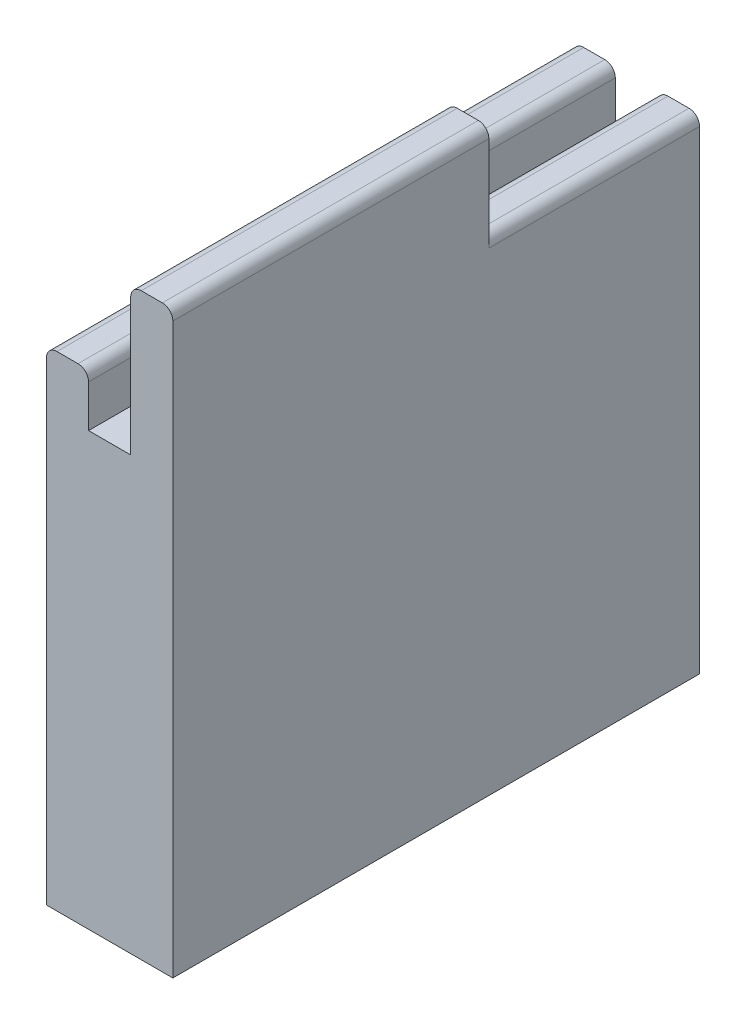
ISO-10303-21;
HEADER;
FILE_DESCRIPTION(('STEP AP214'),'2;1');
FILE_NAME('part.step','',(''),(''),'','','');
FILE_SCHEMA(('AUTOMOTIVE_DESIGN { 1 0 10303 214 1 1 1 1 }'));
ENDSEC;
DATA;
#1=APPLICATION_CONTEXT('core data for automotive mechanical design processes');
#2=APPLICATION_PROTOCOL_DEFINITION('international standard','automotive_design',2000,#1);
#3=PRODUCT_CONTEXT('',#1,'mechanical');
#4=PRODUCT('Part','Part','',(#3));
#5=PRODUCT_RELATED_PRODUCT_CATEGORY('part','',(#4));
#6=PRODUCT_DEFINITION_FORMATION('','',#4);
#7=PRODUCT_DEFINITION_CONTEXT('part definition',#1,'design');
#8=PRODUCT_DEFINITION('design','',#6,#7);
#9=PRODUCT_DEFINITION_SHAPE('','',#8);
#10=(LENGTH_UNIT() NAMED_UNIT(*) SI_UNIT(.MILLI.,.METRE.));
#11=(NAMED_UNIT(*) PLANE_ANGLE_UNIT() SI_UNIT($,.RADIAN.));
#12=(NAMED_UNIT(*) SI_UNIT($,.STERADIAN.) SOLID_ANGLE_UNIT());
#13=UNCERTAINTY_MEASURE_WITH_UNIT(LENGTH_MEASURE(1.E-05),#10,'distance_accuracy_value','');
#14=(GEOMETRIC_REPRESENTATION_CONTEXT(3) GLOBAL_UNCERTAINTY_ASSIGNED_CONTEXT((#13)) GLOBAL_UNIT_ASSIGNED_CONTEXT((#10,
#11,#12)) REPRESENTATION_CONTEXT('',''));
#15=CARTESIAN_POINT('',(0.,0.,0.));
#16=DIRECTION('',(0.,0.,1.));
#17=DIRECTION('',(1.,0.,0.));
#18=AXIS2_PLACEMENT_3D('',#15,#16,#17);
#19=CARTESIAN_POINT('',(-4.12068965517242,-20.5,25.));
#20=DIRECTION('',(1.,0.,0.));
#21=DIRECTION('',(0.,0.,-1.));
#22=AXIS2_PLACEMENT_3D('',#19,#20,#21);
#23=PLANE('',#22);
#24=DIRECTION('',(0.,-1.,0.));
#25=VECTOR('',#24,1.);
#26=CARTESIAN_POINT('',(-4.12068965517242,-20.5,25.));
#27=LINE('',#26,#25);
#28=CARTESIAN_POINT('',(-4.12068965517242,2.,25.));
#29=VERTEX_POINT('',#28);
#30=CARTESIAN_POINT('',(-4.12068965517242,-20.5,25.));
#31=VERTEX_POINT('',#30);
#32=EDGE_CURVE('E264',#29,#31,#27,.T.);
#33=ORIENTED_EDGE('',*,*,#32,.F.);
#34=DIRECTION('',(0.,0.,-1.));
#35=VECTOR('',#34,1.);
#36=CARTESIAN_POINT('',(-4.12068965517242,2.,25.));
#37=LINE('',#36,#35);
#38=CARTESIAN_POINT('',(-4.12068965517242,2.,0.));
#39=VERTEX_POINT('',#38);
#40=EDGE_CURVE('E189',#29,#39,#37,.T.);
#41=ORIENTED_EDGE('',*,*,#40,.T.);
#42=DIRECTION('',(0.,-1.,0.));
#43=VECTOR('',#42,1.);
#44=CARTESIAN_POINT('',(-4.12068965517242,-20.5,0.));
#45=LINE('',#44,#43);
#46=CARTESIAN_POINT('',(-4.12068965517242,-20.5,0.));
#47=VERTEX_POINT('',#46);
#48=EDGE_CURVE('E171',#39,#47,#45,.T.);
#49=ORIENTED_EDGE('',*,*,#48,.T.);
#50=DIRECTION('',(0.,0.,-1.));
#51=VECTOR('',#50,1.);
#52=CARTESIAN_POINT('',(-4.12068965517242,-20.5,25.));
#53=LINE('',#52,#51);
#54=EDGE_CURVE('E270',#31,#47,#53,.T.);
#55=ORIENTED_EDGE('',*,*,#54,.F.);
#56=EDGE_LOOP('',(#33,#41,#49,#55));
#57=FACE_BOUND('',#56,.T.);
#58=ADVANCED_FACE('F39',(#57),#23,.F.);
#59=CARTESIAN_POINT('',(1.87931034482758,-20.5,25.));
#60=DIRECTION('',(0.,1.,0.));
#61=DIRECTION('',(0.,0.,1.));
#62=AXIS2_PLACEMENT_3D('',#59,#60,#61);
#63=PLANE('',#62);
#64=DIRECTION('',(1.,0.,0.));
#65=VECTOR('',#64,1.);
#66=CARTESIAN_POINT('',(1.87931034482758,-20.5,0.));
#67=LINE('',#66,#65);
#68=CARTESIAN_POINT('',(1.87931034482758,-20.5,0.));
#69=VERTEX_POINT('',#68);
#70=EDGE_CURVE('E248',#47,#69,#67,.T.);
#71=ORIENTED_EDGE('',*,*,#70,.T.);
#72=DIRECTION('',(0.,0.,-1.));
#73=VECTOR('',#72,1.);
#74=CARTESIAN_POINT('',(1.87931034482758,-20.5,25.));
#75=LINE('',#74,#73);
#76=CARTESIAN_POINT('',(1.87931034482758,-20.5,25.));
#77=VERTEX_POINT('',#76);
#78=EDGE_CURVE('E268',#77,#69,#75,.T.);
#79=ORIENTED_EDGE('',*,*,#78,.F.);
#80=DIRECTION('',(1.,0.,0.));
#81=VECTOR('',#80,1.);
#82=CARTESIAN_POINT('',(1.87931034482758,-20.5,25.));
#83=LINE('',#82,#81);
#84=EDGE_CURVE('E237',#31,#77,#83,.T.);
#85=ORIENTED_EDGE('',*,*,#84,.F.);
#86=ORIENTED_EDGE('',*,*,#54,.T.);
#87=EDGE_LOOP('',(#71,#79,#85,#86));
#88=FACE_BOUND('',#87,.T.);
#89=ADVANCED_FACE('F308',(#88),#63,.F.);
#90=CARTESIAN_POINT('',(1.87931034482758,2.5,25.));
#91=DIRECTION('',(-1.,0.,0.));
#92=DIRECTION('',(0.,-1.,0.));
#93=AXIS2_PLACEMENT_3D('',#90,#91,#92);
#94=PLANE('',#93);
#95=DIRECTION('',(0.,1.,0.));
#96=VECTOR('',#95,1.);
#97=CARTESIAN_POINT('',(1.87931034482758,2.,10.));
#98=LINE('',#97,#96);
#99=CARTESIAN_POINT('',(1.87931034482758,2.,10.));
#100=VERTEX_POINT('',#99);
#101=CARTESIAN_POINT('',(1.87931034482758,6.5,10.));
#102=VERTEX_POINT('',#101);
#103=EDGE_CURVE('E152',#100,#102,#98,.T.);
#104=ORIENTED_EDGE('',*,*,#103,.T.);
#105=DIRECTION('',(0.,0.,1.));
#106=VECTOR('',#105,1.);
#107=CARTESIAN_POINT('',(1.87931034482758,6.5,25.));
#108=LINE('',#107,#106);
#109=CARTESIAN_POINT('',(1.87931034482758,6.5,25.));
#110=VERTEX_POINT('',#109);
#111=EDGE_CURVE('E204',#102,#110,#108,.T.);
#112=ORIENTED_EDGE('',*,*,#111,.T.);
#113=DIRECTION('',(0.,1.,0.));
#114=VECTOR('',#113,1.);
#115=CARTESIAN_POINT('',(1.87931034482758,2.5,25.));
#116=LINE('',#115,#114);
#117=EDGE_CURVE('E233',#77,#110,#116,.T.);
#118=ORIENTED_EDGE('',*,*,#117,.F.);
#119=ORIENTED_EDGE('',*,*,#78,.T.);
#120=DIRECTION('',(0.,1.,0.));
#121=VECTOR('',#120,1.);
#122=CARTESIAN_POINT('',(1.87931034482758,2.5,0.));
#123=LINE('',#122,#121);
#124=CARTESIAN_POINT('',(1.87931034482758,2.,0.));
#125=VERTEX_POINT('',#124);
#126=EDGE_CURVE('E178',#69,#125,#123,.T.);
#127=ORIENTED_EDGE('',*,*,#126,.T.);
#128=DIRECTION('',(0.,0.,-1.));
#129=VECTOR('',#128,1.);
#130=CARTESIAN_POINT('',(1.87931034482758,2.,25.));
#131=LINE('',#130,#129);
#132=EDGE_CURVE('E169',#125,#100,#131,.F.);
#133=ORIENTED_EDGE('',*,*,#132,.T.);
#134=EDGE_LOOP('',(#104,#112,#118,#119,#127,#133));
#135=FACE_BOUND('',#134,.T.);
#136=ADVANCED_FACE('F175',(#135),#94,.F.);
#137=CARTESIAN_POINT('',(-0.120689655172419,2.5,25.));
#138=DIRECTION('',(0.,-1.,0.));
#139=DIRECTION('',(0.,0.,-1.));
#140=AXIS2_PLACEMENT_3D('',#137,#138,#139);
#141=PLANE('',#140);
#142=DIRECTION('',(0.,0.,-1.));
#143=VECTOR('',#142,1.);
#144=CARTESIAN_POINT('',(0.379310344827581,2.5,25.));
#145=LINE('',#144,#143);
#146=CARTESIAN_POINT('',(0.379310344827581,2.5,0.));
#147=VERTEX_POINT('',#146);
#148=CARTESIAN_POINT('',(0.379310344827581,2.5,10.));
#149=VERTEX_POINT('',#148);
#150=EDGE_CURVE('E273',#147,#149,#145,.F.);
#151=ORIENTED_EDGE('',*,*,#150,.T.);
#152=DIRECTION('',(1.,0.,0.));
#153=VECTOR('',#152,1.);
#154=CARTESIAN_POINT('',(-0.120689655172419,2.5,10.));
#155=LINE('',#154,#153);
#156=CARTESIAN_POINT('',(1.37931034482758,2.5,10.));
#157=VERTEX_POINT('',#156);
#158=EDGE_CURVE('E172',#149,#157,#155,.T.);
#159=ORIENTED_EDGE('',*,*,#158,.T.);
#160=DIRECTION('',(0.,0.,-1.));
#161=VECTOR('',#160,1.);
#162=CARTESIAN_POINT('',(1.37931034482758,2.5,25.));
#163=LINE('',#162,#161);
#164=CARTESIAN_POINT('',(1.37931034482758,2.5,0.));
#165=VERTEX_POINT('',#164);
#166=EDGE_CURVE('E170',#157,#165,#163,.T.);
#167=ORIENTED_EDGE('',*,*,#166,.T.);
#168=DIRECTION('',(-1.,0.,0.));
#169=VECTOR('',#168,1.);
#170=CARTESIAN_POINT('',(-0.120689655172419,2.5,0.));
#171=LINE('',#170,#169);
#172=EDGE_CURVE('E251',#165,#147,#171,.T.);
#173=ORIENTED_EDGE('',*,*,#172,.T.);
#174=EDGE_LOOP('',(#151,#159,#167,#173));
#175=FACE_BOUND('',#174,.T.);
#176=ADVANCED_FACE('F313',(#175),#141,.F.);
#177=CARTESIAN_POINT('',(-0.120689655172419,0.,25.));
#178=DIRECTION('',(1.,0.,0.));
#179=DIRECTION('',(0.,0.,-1.));
#180=AXIS2_PLACEMENT_3D('',#177,#178,#179);
#181=PLANE('',#180);
#182=DIRECTION('',(0.,-1.,0.));
#183=VECTOR('',#182,1.);
#184=CARTESIAN_POINT('',(-0.120689655172419,0.,25.));
#185=LINE('',#184,#183);
#186=CARTESIAN_POINT('',(-0.120689655172419,6.5,25.));
#187=VERTEX_POINT('',#186);
#188=CARTESIAN_POINT('',(-0.120689655172419,0.,25.));
#189=VERTEX_POINT('',#188);
#190=EDGE_CURVE('E226',#187,#189,#185,.T.);
#191=ORIENTED_EDGE('',*,*,#190,.F.);
#192=DIRECTION('',(0.,0.,1.));
#193=VECTOR('',#192,1.);
#194=CARTESIAN_POINT('',(-0.120689655172419,6.5,10.));
#195=LINE('',#194,#193);
#196=CARTESIAN_POINT('',(-0.120689655172419,6.5,10.));
#197=VERTEX_POINT('',#196);
#198=EDGE_CURVE('E11',#187,#197,#195,.F.);
#199=ORIENTED_EDGE('',*,*,#198,.T.);
#200=DIRECTION('',(0.,1.,0.));
#201=VECTOR('',#200,1.);
#202=CARTESIAN_POINT('',(-0.120689655172419,2.,10.));
#203=LINE('',#202,#201);
#204=CARTESIAN_POINT('',(-0.120689655172419,2.,10.));
#205=VERTEX_POINT('',#204);
#206=EDGE_CURVE('E162',#205,#197,#203,.T.);
#207=ORIENTED_EDGE('',*,*,#206,.F.);
#208=DIRECTION('',(0.,0.,-1.));
#209=VECTOR('',#208,1.);
#210=CARTESIAN_POINT('',(-0.120689655172419,2.,25.));
#211=LINE('',#210,#209);
#212=CARTESIAN_POINT('',(-0.120689655172419,2.,0.));
#213=VERTEX_POINT('',#212);
#214=EDGE_CURVE('E197',#205,#213,#211,.T.);
#215=ORIENTED_EDGE('',*,*,#214,.T.);
#216=DIRECTION('',(0.,-1.,0.));
#217=VECTOR('',#216,1.);
#218=CARTESIAN_POINT('',(-0.120689655172419,0.,0.));
#219=LINE('',#218,#217);
#220=CARTESIAN_POINT('',(-0.120689655172419,0.,0.));
#221=VERTEX_POINT('',#220);
#222=EDGE_CURVE('E254',#213,#221,#219,.T.);
#223=ORIENTED_EDGE('',*,*,#222,.T.);
#224=DIRECTION('',(0.,0.,-1.));
#225=VECTOR('',#224,1.);
#226=CARTESIAN_POINT('',(-0.120689655172419,0.,25.));
#227=LINE('',#226,#225);
#228=EDGE_CURVE('E230',#189,#221,#227,.T.);
#229=ORIENTED_EDGE('',*,*,#228,.F.);
#230=EDGE_LOOP('',(#191,#199,#207,#215,#223,#229));
#231=FACE_BOUND('',#230,.T.);
#232=ADVANCED_FACE('F228',(#231),#181,.F.);
#233=CARTESIAN_POINT('',(-2.12068965517242,0.,25.));
#234=DIRECTION('',(0.,-1.,0.));
#235=DIRECTION('',(0.,0.,-1.));
#236=AXIS2_PLACEMENT_3D('',#233,#234,#235);
#237=PLANE('',#236);
#238=DIRECTION('',(-1.,0.,0.));
#239=VECTOR('',#238,1.);
#240=CARTESIAN_POINT('',(-2.12068965517242,0.,0.));
#241=LINE('',#240,#239);
#242=CARTESIAN_POINT('',(-2.12068965517242,0.,0.));
#243=VERTEX_POINT('',#242);
#244=EDGE_CURVE('E256',#221,#243,#241,.T.);
#245=ORIENTED_EDGE('',*,*,#244,.T.);
#246=DIRECTION('',(0.,0.,-1.));
#247=VECTOR('',#246,1.);
#248=CARTESIAN_POINT('',(-2.12068965517242,0.,25.));
#249=LINE('',#248,#247);
#250=CARTESIAN_POINT('',(-2.12068965517242,0.,25.));
#251=VERTEX_POINT('',#250);
#252=EDGE_CURVE('E246',#251,#243,#249,.T.);
#253=ORIENTED_EDGE('',*,*,#252,.F.);
#254=DIRECTION('',(-1.,0.,0.));
#255=VECTOR('',#254,1.);
#256=CARTESIAN_POINT('',(-2.12068965517242,0.,25.));
#257=LINE('',#256,#255);
#258=EDGE_CURVE('E232',#189,#251,#257,.T.);
#259=ORIENTED_EDGE('',*,*,#258,.F.);
#260=ORIENTED_EDGE('',*,*,#228,.T.);
#261=EDGE_LOOP('',(#245,#253,#259,#260));
#262=FACE_BOUND('',#261,.T.);
#263=ADVANCED_FACE('F320',(#262),#237,.F.);
#264=CARTESIAN_POINT('',(-2.12068965517242,2.5,25.));
#265=DIRECTION('',(-1.,0.,0.));
#266=DIRECTION('',(0.,0.,1.));
#267=AXIS2_PLACEMENT_3D('',#264,#265,#266);
#268=PLANE('',#267);
#269=DIRECTION('',(0.,1.,0.));
#270=VECTOR('',#269,1.);
#271=CARTESIAN_POINT('',(-2.12068965517242,2.5,0.));
#272=LINE('',#271,#270);
#273=CARTESIAN_POINT('',(-2.12068965517242,2.,0.));
#274=VERTEX_POINT('',#273);
#275=EDGE_CURVE('E258',#243,#274,#272,.T.);
#276=ORIENTED_EDGE('',*,*,#275,.T.);
#277=DIRECTION('',(0.,0.,-1.));
#278=VECTOR('',#277,1.);
#279=CARTESIAN_POINT('',(-2.12068965517242,2.,25.));
#280=LINE('',#279,#278);
#281=CARTESIAN_POINT('',(-2.12068965517242,2.,25.));
#282=VERTEX_POINT('',#281);
#283=EDGE_CURVE('E199',#274,#282,#280,.F.);
#284=ORIENTED_EDGE('',*,*,#283,.T.);
#285=DIRECTION('',(0.,1.,0.));
#286=VECTOR('',#285,1.);
#287=CARTESIAN_POINT('',(-2.12068965517242,2.5,25.));
#288=LINE('',#287,#286);
#289=EDGE_CURVE('E235',#251,#282,#288,.T.);
#290=ORIENTED_EDGE('',*,*,#289,.F.);
#291=ORIENTED_EDGE('',*,*,#252,.T.);
#292=EDGE_LOOP('',(#276,#284,#290,#291));
#293=FACE_BOUND('',#292,.T.);
#294=ADVANCED_FACE('F325',(#293),#268,.F.);
#295=CARTESIAN_POINT('',(-4.12068965517242,2.5,25.));
#296=DIRECTION('',(0.,-1.,0.));
#297=DIRECTION('',(0.,0.,-1.));
#298=AXIS2_PLACEMENT_3D('',#295,#296,#297);
#299=PLANE('',#298);
#300=DIRECTION('',(-1.,0.,0.));
#301=VECTOR('',#300,1.);
#302=CARTESIAN_POINT('',(-4.12068965517242,2.5,0.));
#303=LINE('',#302,#301);
#304=CARTESIAN_POINT('',(-2.62068965517242,2.5,0.));
#305=VERTEX_POINT('',#304);
#306=CARTESIAN_POINT('',(-3.62068965517242,2.5,0.));
#307=VERTEX_POINT('',#306);
#308=EDGE_CURVE('E261',#305,#307,#303,.T.);
#309=ORIENTED_EDGE('',*,*,#308,.T.);
#310=DIRECTION('',(0.,0.,-1.));
#311=VECTOR('',#310,1.);
#312=CARTESIAN_POINT('',(-3.62068965517242,2.5,25.));
#313=LINE('',#312,#311);
#314=CARTESIAN_POINT('',(-3.62068965517242,2.5,25.));
#315=VERTEX_POINT('',#314);
#316=EDGE_CURVE('E195',#307,#315,#313,.F.);
#317=ORIENTED_EDGE('',*,*,#316,.T.);
#318=DIRECTION('',(-1.,0.,0.));
#319=VECTOR('',#318,1.);
#320=CARTESIAN_POINT('',(-4.12068965517242,2.5,25.));
#321=LINE('',#320,#319);
#322=CARTESIAN_POINT('',(-2.62068965517242,2.5,25.));
#323=VERTEX_POINT('',#322);
#324=EDGE_CURVE('E243',#323,#315,#321,.T.);
#325=ORIENTED_EDGE('',*,*,#324,.F.);
#326=DIRECTION('',(0.,0.,-1.));
#327=VECTOR('',#326,1.);
#328=CARTESIAN_POINT('',(-2.62068965517242,2.5,25.));
#329=LINE('',#328,#327);
#330=EDGE_CURVE('E192',#323,#305,#329,.T.);
#331=ORIENTED_EDGE('',*,*,#330,.T.);
#332=EDGE_LOOP('',(#309,#317,#325,#331));
#333=FACE_BOUND('',#332,.T.);
#334=ADVANCED_FACE('F290',(#333),#299,.F.);
#335=CARTESIAN_POINT('',(0.,0.,25.));
#336=DIRECTION('',(0.,0.,-1.));
#337=DIRECTION('',(-1.,0.,0.));
#338=AXIS2_PLACEMENT_3D('',#335,#336,#337);
#339=PLANE('',#338);
#340=ORIENTED_EDGE('',*,*,#117,.T.);
#341=CARTESIAN_POINT('',(1.37931034482758,6.5,25.));
#342=DIRECTION('',(0.,0.,-1.));
#343=DIRECTION('',(-1.,0.,0.));
#344=AXIS2_PLACEMENT_3D('',#341,#342,#343);
#345=CIRCLE('',#344,0.5);
#346=CARTESIAN_POINT('',(1.37931034482758,7.,25.));
#347=VERTEX_POINT('',#346);
#348=EDGE_CURVE('E208',#110,#347,#345,.F.);
#349=ORIENTED_EDGE('',*,*,#348,.T.);
#350=DIRECTION('',(1.,0.,0.));
#351=VECTOR('',#350,1.);
#352=CARTESIAN_POINT('',(-0.120689655172419,7.,25.));
#353=LINE('',#352,#351);
#354=CARTESIAN_POINT('',(0.379310344827581,7.,25.));
#355=VERTEX_POINT('',#354);
#356=EDGE_CURVE('E221',#355,#347,#353,.T.);
#357=ORIENTED_EDGE('',*,*,#356,.F.);
#358=CARTESIAN_POINT('',(0.379310344827581,6.5,25.));
#359=DIRECTION('',(0.,0.,-1.));
#360=DIRECTION('',(-1.,0.,0.));
#361=AXIS2_PLACEMENT_3D('',#358,#359,#360);
#362=CIRCLE('',#361,0.5);
#363=EDGE_CURVE('E206',#355,#187,#362,.F.);
#364=ORIENTED_EDGE('',*,*,#363,.T.);
#365=ORIENTED_EDGE('',*,*,#190,.T.);
#366=ORIENTED_EDGE('',*,*,#258,.T.);
#367=ORIENTED_EDGE('',*,*,#289,.T.);
#368=CARTESIAN_POINT('',(-2.62068965517242,2.,25.));
#369=DIRECTION('',(0.,0.,-1.));
#370=DIRECTION('',(-1.,0.,0.));
#371=AXIS2_PLACEMENT_3D('',#368,#369,#370);
#372=CIRCLE('',#371,0.5);
#373=EDGE_CURVE('E179',#282,#323,#372,.F.);
#374=ORIENTED_EDGE('',*,*,#373,.T.);
#375=ORIENTED_EDGE('',*,*,#324,.T.);
#376=CARTESIAN_POINT('',(-3.62068965517242,2.,25.));
#377=DIRECTION('',(0.,0.,-1.));
#378=DIRECTION('',(-1.,0.,0.));
#379=AXIS2_PLACEMENT_3D('',#376,#377,#378);
#380=CIRCLE('',#379,0.5);
#381=EDGE_CURVE('E182',#315,#29,#380,.F.);
#382=ORIENTED_EDGE('',*,*,#381,.T.);
#383=ORIENTED_EDGE('',*,*,#32,.T.);
#384=ORIENTED_EDGE('',*,*,#84,.T.);
#385=EDGE_LOOP('',(#340,#349,#357,#364,#365,#366,#367,#374,#375,#382,#383,#384));
#386=FACE_BOUND('',#385,.T.);
#387=ADVANCED_FACE('F225',(#386),#339,.F.);
#388=CARTESIAN_POINT('',(0.,0.,0.));
#389=DIRECTION('',(0.,0.,-1.));
#390=DIRECTION('',(-1.,0.,0.));
#391=AXIS2_PLACEMENT_3D('',#388,#389,#390);
#392=PLANE('',#391);
#393=ORIENTED_EDGE('',*,*,#172,.F.);
#394=CARTESIAN_POINT('',(1.37931034482758,2.,0.));
#395=DIRECTION('',(0.,0.,-1.));
#396=DIRECTION('',(-1.,0.,0.));
#397=AXIS2_PLACEMENT_3D('',#394,#395,#396);
#398=CIRCLE('',#397,0.5);
#399=EDGE_CURVE('E180',#165,#125,#398,.T.);
#400=ORIENTED_EDGE('',*,*,#399,.T.);
#401=ORIENTED_EDGE('',*,*,#126,.F.);
#402=ORIENTED_EDGE('',*,*,#70,.F.);
#403=ORIENTED_EDGE('',*,*,#48,.F.);
#404=CARTESIAN_POINT('',(-3.62068965517242,2.,0.));
#405=DIRECTION('',(0.,0.,-1.));
#406=DIRECTION('',(-1.,0.,0.));
#407=AXIS2_PLACEMENT_3D('',#404,#405,#406);
#408=CIRCLE('',#407,0.5);
#409=EDGE_CURVE('E184',#39,#307,#408,.T.);
#410=ORIENTED_EDGE('',*,*,#409,.T.);
#411=ORIENTED_EDGE('',*,*,#308,.F.);
#412=CARTESIAN_POINT('',(-2.62068965517242,2.,0.));
#413=DIRECTION('',(0.,0.,-1.));
#414=DIRECTION('',(-1.,0.,0.));
#415=AXIS2_PLACEMENT_3D('',#412,#413,#414);
#416=CIRCLE('',#415,0.5);
#417=EDGE_CURVE('E277',#305,#274,#416,.T.);
#418=ORIENTED_EDGE('',*,*,#417,.T.);
#419=ORIENTED_EDGE('',*,*,#275,.F.);
#420=ORIENTED_EDGE('',*,*,#244,.F.);
#421=ORIENTED_EDGE('',*,*,#222,.F.);
#422=CARTESIAN_POINT('',(0.379310344827581,2.,0.));
#423=DIRECTION('',(0.,0.,-1.));
#424=DIRECTION('',(-1.,0.,0.));
#425=AXIS2_PLACEMENT_3D('',#422,#423,#424);
#426=CIRCLE('',#425,0.5);
#427=EDGE_CURVE('E279',#213,#147,#426,.T.);
#428=ORIENTED_EDGE('',*,*,#427,.T.);
#429=EDGE_LOOP('',(#393,#400,#401,#402,#403,#410,#411,#418,#419,#420,#421,#428));
#430=FACE_BOUND('',#429,.T.);
#431=ADVANCED_FACE('F284',(#430),#392,.T.);
#432=CARTESIAN_POINT('',(1.37931034482758,2.,25.));
#433=DIRECTION('',(0.,0.,-1.));
#434=DIRECTION('',(-1.,0.,0.));
#435=AXIS2_PLACEMENT_3D('',#432,#433,#434);
#436=CYLINDRICAL_SURFACE('',#435,0.5);
#437=CARTESIAN_POINT('',(1.37931034482758,2.,10.));
#438=DIRECTION('',(0.,0.,-1.));
#439=DIRECTION('',(-1.,0.,0.));
#440=AXIS2_PLACEMENT_3D('',#437,#438,#439);
#441=CIRCLE('',#440,0.5);
#442=EDGE_CURVE('E155',#100,#157,#441,.F.);
#443=ORIENTED_EDGE('',*,*,#442,.F.);
#444=ORIENTED_EDGE('',*,*,#132,.F.);
#445=ORIENTED_EDGE('',*,*,#399,.F.);
#446=ORIENTED_EDGE('',*,*,#166,.F.);
#447=EDGE_LOOP('',(#443,#444,#445,#446));
#448=FACE_BOUND('',#447,.T.);
#449=ADVANCED_FACE('F167',(#448),#436,.T.);
#450=CARTESIAN_POINT('',(-3.62068965517242,2.,25.));
#451=DIRECTION('',(0.,0.,-1.));
#452=DIRECTION('',(-1.,0.,0.));
#453=AXIS2_PLACEMENT_3D('',#450,#451,#452);
#454=CYLINDRICAL_SURFACE('',#453,0.5);
#455=ORIENTED_EDGE('',*,*,#381,.F.);
#456=ORIENTED_EDGE('',*,*,#316,.F.);
#457=ORIENTED_EDGE('',*,*,#409,.F.);
#458=ORIENTED_EDGE('',*,*,#40,.F.);
#459=EDGE_LOOP('',(#455,#456,#457,#458));
#460=FACE_BOUND('',#459,.T.);
#461=ADVANCED_FACE('F294',(#460),#454,.T.);
#462=CARTESIAN_POINT('',(0.379310344827581,2.,25.));
#463=DIRECTION('',(0.,0.,-1.));
#464=DIRECTION('',(-1.,0.,0.));
#465=AXIS2_PLACEMENT_3D('',#462,#463,#464);
#466=CYLINDRICAL_SURFACE('',#465,0.5);
#467=CARTESIAN_POINT('',(0.379310344827581,2.,10.));
#468=DIRECTION('',(0.,0.,-1.));
#469=DIRECTION('',(-1.,0.,0.));
#470=AXIS2_PLACEMENT_3D('',#467,#468,#469);
#471=CIRCLE('',#470,0.5);
#472=EDGE_CURVE('E201',#149,#205,#471,.F.);
#473=ORIENTED_EDGE('',*,*,#472,.F.);
#474=ORIENTED_EDGE('',*,*,#150,.F.);
#475=ORIENTED_EDGE('',*,*,#427,.F.);
#476=ORIENTED_EDGE('',*,*,#214,.F.);
#477=EDGE_LOOP('',(#473,#474,#475,#476));
#478=FACE_BOUND('',#477,.T.);
#479=ADVANCED_FACE('F316',(#478),#466,.T.);
#480=CARTESIAN_POINT('',(-2.62068965517242,2.,25.));
#481=DIRECTION('',(0.,0.,-1.));
#482=DIRECTION('',(-1.,0.,0.));
#483=AXIS2_PLACEMENT_3D('',#480,#481,#482);
#484=CYLINDRICAL_SURFACE('',#483,0.5);
#485=ORIENTED_EDGE('',*,*,#373,.F.);
#486=ORIENTED_EDGE('',*,*,#283,.F.);
#487=ORIENTED_EDGE('',*,*,#417,.F.);
#488=ORIENTED_EDGE('',*,*,#330,.F.);
#489=EDGE_LOOP('',(#485,#486,#487,#488));
#490=FACE_BOUND('',#489,.T.);
#491=ADVANCED_FACE('F329',(#490),#484,.T.);
#492=CARTESIAN_POINT('',(-0.120689655172419,7.,25.));
#493=DIRECTION('',(0.,1.,0.));
#494=DIRECTION('',(-1.,0.,0.));
#495=AXIS2_PLACEMENT_3D('',#492,#493,#494);
#496=PLANE('',#495);
#497=ORIENTED_EDGE('',*,*,#356,.T.);
#498=DIRECTION('',(0.,0.,1.));
#499=VECTOR('',#498,1.);
#500=CARTESIAN_POINT('',(1.37931034482758,7.,10.));
#501=LINE('',#500,#499);
#502=CARTESIAN_POINT('',(1.37931034482758,7.,10.));
#503=VERTEX_POINT('',#502);
#504=EDGE_CURVE('E60',#347,#503,#501,.F.);
#505=ORIENTED_EDGE('',*,*,#504,.T.);
#506=DIRECTION('',(1.,0.,0.));
#507=VECTOR('',#506,1.);
#508=CARTESIAN_POINT('',(-0.120689655172419,7.,10.));
#509=LINE('',#508,#507);
#510=CARTESIAN_POINT('',(0.379310344827581,7.,10.));
#511=VERTEX_POINT('',#510);
#512=EDGE_CURVE('E216',#511,#503,#509,.T.);
#513=ORIENTED_EDGE('',*,*,#512,.F.);
#514=DIRECTION('',(0.,0.,1.));
#515=VECTOR('',#514,1.);
#516=CARTESIAN_POINT('',(0.379310344827581,7.,25.));
#517=LINE('',#516,#515);
#518=EDGE_CURVE('E210',#511,#355,#517,.T.);
#519=ORIENTED_EDGE('',*,*,#518,.T.);
#520=EDGE_LOOP('',(#497,#505,#513,#519));
#521=FACE_BOUND('',#520,.T.);
#522=ADVANCED_FACE('F219',(#521),#496,.T.);
#523=CARTESIAN_POINT('',(-0.120689655172419,2.,10.));
#524=DIRECTION('',(0.,0.,-1.));
#525=DIRECTION('',(-1.,0.,0.));
#526=AXIS2_PLACEMENT_3D('',#523,#524,#525);
#527=PLANE('',#526);
#528=ORIENTED_EDGE('',*,*,#512,.T.);
#529=CARTESIAN_POINT('',(1.37931034482758,6.5,10.));
#530=DIRECTION('',(0.,0.,-1.));
#531=DIRECTION('',(-1.,0.,0.));
#532=AXIS2_PLACEMENT_3D('',#529,#530,#531);
#533=CIRCLE('',#532,0.5);
#534=EDGE_CURVE('E47',#503,#102,#533,.T.);
#535=ORIENTED_EDGE('',*,*,#534,.T.);
#536=ORIENTED_EDGE('',*,*,#103,.F.);
#537=ORIENTED_EDGE('',*,*,#442,.T.);
#538=ORIENTED_EDGE('',*,*,#158,.F.);
#539=ORIENTED_EDGE('',*,*,#472,.T.);
#540=ORIENTED_EDGE('',*,*,#206,.T.);
#541=CARTESIAN_POINT('',(0.379310344827581,6.5,10.));
#542=DIRECTION('',(0.,0.,-1.));
#543=DIRECTION('',(-1.,0.,0.));
#544=AXIS2_PLACEMENT_3D('',#541,#542,#543);
#545=CIRCLE('',#544,0.5);
#546=EDGE_CURVE('E214',#197,#511,#545,.T.);
#547=ORIENTED_EDGE('',*,*,#546,.T.);
#548=EDGE_LOOP('',(#528,#535,#536,#537,#538,#539,#540,#547));
#549=FACE_BOUND('',#548,.T.);
#550=ADVANCED_FACE('F154',(#549),#527,.T.);
#551=CARTESIAN_POINT('',(1.37931034482758,6.5,25.));
#552=DIRECTION('',(0.,0.,-1.));
#553=DIRECTION('',(-1.,0.,0.));
#554=AXIS2_PLACEMENT_3D('',#551,#552,#553);
#555=CYLINDRICAL_SURFACE('',#554,0.5);
#556=ORIENTED_EDGE('',*,*,#534,.F.);
#557=ORIENTED_EDGE('',*,*,#504,.F.);
#558=ORIENTED_EDGE('',*,*,#348,.F.);
#559=ORIENTED_EDGE('',*,*,#111,.F.);
#560=EDGE_LOOP('',(#556,#557,#558,#559));
#561=FACE_BOUND('',#560,.T.);
#562=ADVANCED_FACE('F304',(#561),#555,.T.);
#563=CARTESIAN_POINT('',(0.379310344827581,6.5,25.));
#564=DIRECTION('',(0.,0.,-1.));
#565=DIRECTION('',(-1.,0.,0.));
#566=AXIS2_PLACEMENT_3D('',#563,#564,#565);
#567=CYLINDRICAL_SURFACE('',#566,0.5);
#568=ORIENTED_EDGE('',*,*,#546,.F.);
#569=ORIENTED_EDGE('',*,*,#198,.F.);
#570=ORIENTED_EDGE('',*,*,#363,.F.);
#571=ORIENTED_EDGE('',*,*,#518,.F.);
#572=EDGE_LOOP('',(#568,#569,#570,#571));
#573=FACE_BOUND('',#572,.T.);
#574=ADVANCED_FACE('F41',(#573),#567,.T.);
#575=CLOSED_SHELL('',(#58,#89,#136,#176,#232,#263,#294,#334,#387,#431,#449,#461,#479,#491,#522,
#550,#562,#574));
#576=MANIFOLD_SOLID_BREP('B2',#575);
#577=ADVANCED_BREP_SHAPE_REPRESENTATION('',(#18,#576),#14);
#578=SHAPE_DEFINITION_REPRESENTATION(#9,#577);
ENDSEC;
END-ISO-10303-21;
